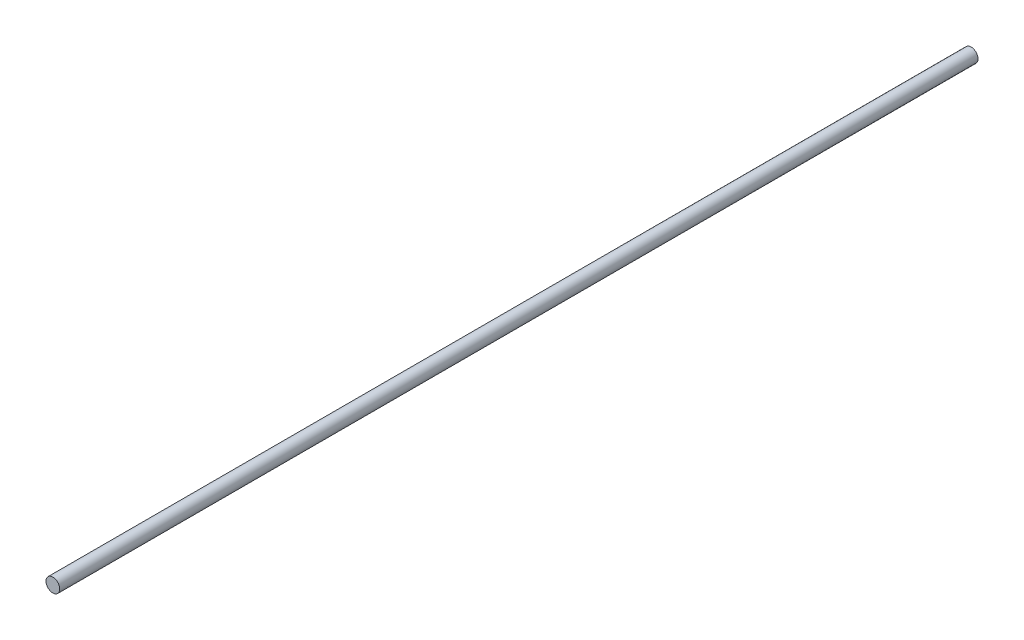
ISO-10303-21;
HEADER;
FILE_DESCRIPTION(('STEP AP214'),'2;1');
FILE_NAME('part.step','',(''),(''),'','','');
FILE_SCHEMA(('AUTOMOTIVE_DESIGN { 1 0 10303 214 1 1 1 1 }'));
ENDSEC;
DATA;
#1=APPLICATION_CONTEXT('core data for automotive mechanical design processes');
#2=APPLICATION_PROTOCOL_DEFINITION('international standard','automotive_design',2000,#1);
#3=PRODUCT_CONTEXT('',#1,'mechanical');
#4=PRODUCT('Part','Part','',(#3));
#5=PRODUCT_RELATED_PRODUCT_CATEGORY('part','',(#4));
#6=PRODUCT_DEFINITION_FORMATION('','',#4);
#7=PRODUCT_DEFINITION_CONTEXT('part definition',#1,'design');
#8=PRODUCT_DEFINITION('design','',#6,#7);
#9=PRODUCT_DEFINITION_SHAPE('','',#8);
#10=(LENGTH_UNIT() NAMED_UNIT(*) SI_UNIT(.MILLI.,.METRE.));
#11=(NAMED_UNIT(*) PLANE_ANGLE_UNIT() SI_UNIT($,.RADIAN.));
#12=(NAMED_UNIT(*) SI_UNIT($,.STERADIAN.) SOLID_ANGLE_UNIT());
#13=UNCERTAINTY_MEASURE_WITH_UNIT(LENGTH_MEASURE(1.E-05),#10,'distance_accuracy_value','');
#14=(GEOMETRIC_REPRESENTATION_CONTEXT(3) GLOBAL_UNCERTAINTY_ASSIGNED_CONTEXT((#13)) GLOBAL_UNIT_ASSIGNED_CONTEXT((#10,
#11,#12)) REPRESENTATION_CONTEXT('',''));
#15=CARTESIAN_POINT('',(0.,0.,0.));
#16=DIRECTION('',(0.,0.,1.));
#17=DIRECTION('',(1.,0.,0.));
#18=AXIS2_PLACEMENT_3D('',#15,#16,#17);
#19=CARTESIAN_POINT('',(0.,0.,400.));
#20=DIRECTION('',(0.,0.,-1.));
#21=DIRECTION('',(-1.,0.,0.));
#22=AXIS2_PLACEMENT_3D('',#19,#20,#21);
#23=CYLINDRICAL_SURFACE('',#22,3.);
#24=CARTESIAN_POINT('',(0.,0.,400.));
#25=DIRECTION('',(0.,0.,1.));
#26=DIRECTION('',(1.,0.,0.));
#27=AXIS2_PLACEMENT_3D('',#24,#25,#26);
#28=CIRCLE('',#27,3.);
#29=CARTESIAN_POINT('',(3.,0.,400.));
#30=VERTEX_POINT('',#29);
#31=EDGE_CURVE('E10',#30,#30,#28,.T.);
#32=ORIENTED_EDGE('',*,*,#31,.F.);
#33=EDGE_LOOP('',(#32));
#34=FACE_BOUND('',#33,.T.);
#35=CARTESIAN_POINT('',(0.,0.,0.));
#36=DIRECTION('',(0.,0.,1.));
#37=DIRECTION('',(1.,0.,0.));
#38=AXIS2_PLACEMENT_3D('',#35,#36,#37);
#39=CIRCLE('',#38,3.);
#40=CARTESIAN_POINT('',(3.,0.,0.));
#41=VERTEX_POINT('',#40);
#42=EDGE_CURVE('E32',#41,#41,#39,.T.);
#43=ORIENTED_EDGE('',*,*,#42,.T.);
#44=EDGE_LOOP('',(#43));
#45=FACE_BOUND('',#44,.T.);
#46=ADVANCED_FACE('F29',(#34,#45),#23,.T.);
#47=CARTESIAN_POINT('',(0.,0.,400.));
#48=DIRECTION('',(0.,0.,1.));
#49=DIRECTION('',(1.,0.,0.));
#50=AXIS2_PLACEMENT_3D('',#47,#48,#49);
#51=PLANE('',#50);
#52=ORIENTED_EDGE('',*,*,#31,.T.);
#53=EDGE_LOOP('',(#52));
#54=FACE_BOUND('',#53,.T.);
#55=ADVANCED_FACE('F44',(#54),#51,.T.);
#56=CARTESIAN_POINT('',(0.,0.,0.));
#57=DIRECTION('',(0.,0.,1.));
#58=DIRECTION('',(1.,0.,0.));
#59=AXIS2_PLACEMENT_3D('',#56,#57,#58);
#60=PLANE('',#59);
#61=ORIENTED_EDGE('',*,*,#42,.F.);
#62=EDGE_LOOP('',(#61));
#63=FACE_BOUND('',#62,.T.);
#64=ADVANCED_FACE('F42',(#63),#60,.F.);
#65=CLOSED_SHELL('',(#46,#55,#64));
#66=MANIFOLD_SOLID_BREP('B2',#65);
#67=ADVANCED_BREP_SHAPE_REPRESENTATION('',(#18,#66),#14);
#68=SHAPE_DEFINITION_REPRESENTATION(#9,#67);
ENDSEC;
END-ISO-10303-21;
